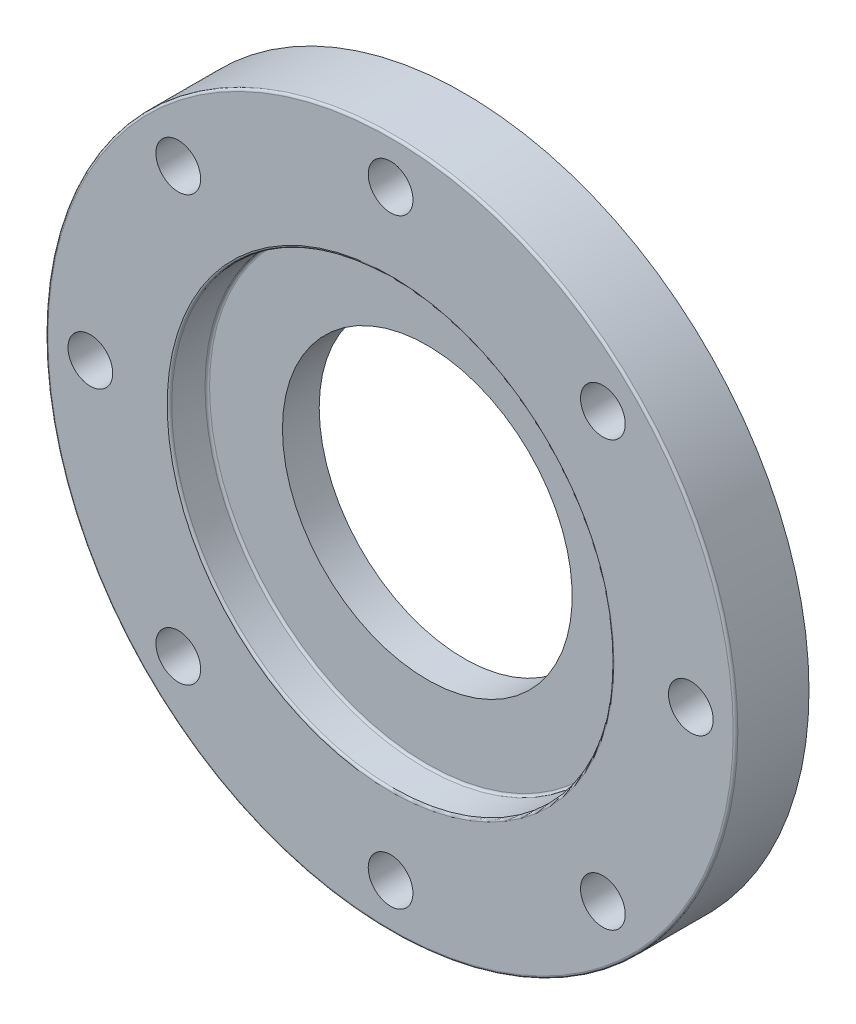
ISO-10303-21;
HEADER;
FILE_DESCRIPTION(('STEP AP214'),'2;1');
FILE_NAME('part.step','',(''),(''),'','','');
FILE_SCHEMA(('AUTOMOTIVE_DESIGN { 1 0 10303 214 1 1 1 1 }'));
ENDSEC;
DATA;
#1=APPLICATION_CONTEXT('core data for automotive mechanical design processes');
#2=APPLICATION_PROTOCOL_DEFINITION('international standard','automotive_design',2000,#1);
#3=PRODUCT_CONTEXT('',#1,'mechanical');
#4=PRODUCT('Part','Part','',(#3));
#5=PRODUCT_RELATED_PRODUCT_CATEGORY('part','',(#4));
#6=PRODUCT_DEFINITION_FORMATION('','',#4);
#7=PRODUCT_DEFINITION_CONTEXT('part definition',#1,'design');
#8=PRODUCT_DEFINITION('design','',#6,#7);
#9=PRODUCT_DEFINITION_SHAPE('','',#8);
#10=(LENGTH_UNIT() NAMED_UNIT(*) SI_UNIT(.MILLI.,.METRE.));
#11=(NAMED_UNIT(*) PLANE_ANGLE_UNIT() SI_UNIT($,.RADIAN.));
#12=(NAMED_UNIT(*) SI_UNIT($,.STERADIAN.) SOLID_ANGLE_UNIT());
#13=UNCERTAINTY_MEASURE_WITH_UNIT(LENGTH_MEASURE(1.E-05),#10,'distance_accuracy_value','');
#14=(GEOMETRIC_REPRESENTATION_CONTEXT(3) GLOBAL_UNCERTAINTY_ASSIGNED_CONTEXT((#13)) GLOBAL_UNIT_ASSIGNED_CONTEXT((#10,
#11,#12)) REPRESENTATION_CONTEXT('',''));
#15=CARTESIAN_POINT('',(0.,0.,0.));
#16=DIRECTION('',(0.,0.,1.));
#17=DIRECTION('',(1.,0.,0.));
#18=AXIS2_PLACEMENT_3D('',#15,#16,#17);
#19=CARTESIAN_POINT('',(0.,0.,36.5125));
#20=DIRECTION('',(0.,0.,-1.));
#21=DIRECTION('',(-1.,0.,0.));
#22=AXIS2_PLACEMENT_3D('',#19,#20,#21);
#23=CYLINDRICAL_SURFACE('',#22,171.45);
#24=CARTESIAN_POINT('',(0.,0.,35.3579545454545));
#25=DIRECTION('',(0.,0.,1.));
#26=DIRECTION('',(1.,0.,0.));
#27=AXIS2_PLACEMENT_3D('',#24,#25,#26);
#28=CIRCLE('',#27,171.45);
#29=CARTESIAN_POINT('',(171.45,0.,35.3579545454545));
#30=VERTEX_POINT('',#29);
#31=EDGE_CURVE('E10',#30,#30,#28,.F.);
#32=ORIENTED_EDGE('',*,*,#31,.T.);
#33=EDGE_LOOP('',(#32));
#34=FACE_BOUND('',#33,.T.);
#35=CARTESIAN_POINT('',(0.,0.,0.));
#36=DIRECTION('',(0.,0.,1.));
#37=DIRECTION('',(1.,0.,0.));
#38=AXIS2_PLACEMENT_3D('',#35,#36,#37);
#39=CIRCLE('',#38,171.45);
#40=CARTESIAN_POINT('',(171.45,0.,0.));
#41=VERTEX_POINT('',#40);
#42=EDGE_CURVE('E70',#41,#41,#39,.T.);
#43=ORIENTED_EDGE('',*,*,#42,.T.);
#44=EDGE_LOOP('',(#43));
#45=FACE_BOUND('',#44,.T.);
#46=ADVANCED_FACE('F38',(#34,#45),#23,.T.);
#47=CARTESIAN_POINT('',(0.,0.,36.5125));
#48=DIRECTION('',(0.,0.,1.));
#49=DIRECTION('',(1.,0.,0.));
#50=AXIS2_PLACEMENT_3D('',#47,#48,#49);
#51=PLANE('',#50);
#52=CARTESIAN_POINT('',(0.,0.,36.5125));
#53=DIRECTION('',(0.,0.,1.));
#54=DIRECTION('',(1.,0.,0.));
#55=AXIS2_PLACEMENT_3D('',#52,#53,#54);
#56=CIRCLE('',#55,111.037468728978);
#57=CARTESIAN_POINT('',(111.037468728978,0.,36.5125));
#58=VERTEX_POINT('',#57);
#59=EDGE_CURVE('E47',#58,#58,#56,.F.);
#60=ORIENTED_EDGE('',*,*,#59,.T.);
#61=EDGE_LOOP('',(#60));
#62=FACE_BOUND('',#61,.T.);
#63=CARTESIAN_POINT('',(0.,0.,36.5125));
#64=DIRECTION('',(0.,0.,1.));
#65=DIRECTION('',(1.,0.,0.));
#66=AXIS2_PLACEMENT_3D('',#63,#64,#65);
#67=CIRCLE('',#66,170.295454545455);
#68=CARTESIAN_POINT('',(170.295454545455,0.,36.5125));
#69=VERTEX_POINT('',#68);
#70=EDGE_CURVE('E52',#69,#69,#67,.T.);
#71=ORIENTED_EDGE('',*,*,#70,.T.);
#72=EDGE_LOOP('',(#71));
#73=FACE_BOUND('',#72,.T.);
#74=CARTESIAN_POINT('',(105.518009422561,105.518009422564,36.5125));
#75=DIRECTION('',(0.,0.,1.));
#76=DIRECTION('',(0.707106781186556,-0.707106781186539,0.));
#77=AXIS2_PLACEMENT_3D('',#74,#75,#76);
#78=CIRCLE('',#77,11.1125);
#79=CARTESIAN_POINT('',(113.375733528497,97.6602853166284,36.5125));
#80=VERTEX_POINT('',#79);
#81=EDGE_CURVE('E131',#80,#80,#78,.T.);
#82=ORIENTED_EDGE('',*,*,#81,.F.);
#83=EDGE_LOOP('',(#82));
#84=FACE_BOUND('',#83,.T.);
#85=CARTESIAN_POINT('',(149.225,1.5630489083666E-12,36.5125));
#86=DIRECTION('',(0.,0.,1.));
#87=DIRECTION('',(0.,-1.,0.));
#88=AXIS2_PLACEMENT_3D('',#85,#86,#87);
#89=CIRCLE('',#88,11.1125);
#90=CARTESIAN_POINT('',(149.225,-11.1124999999984,36.5125));
#91=VERTEX_POINT('',#90);
#92=EDGE_CURVE('E123',#91,#91,#89,.T.);
#93=ORIENTED_EDGE('',*,*,#92,.F.);
#94=EDGE_LOOP('',(#93));
#95=FACE_BOUND('',#94,.T.);
#96=CARTESIAN_POINT('',(105.518009422563,-105.518009422562,36.5125));
#97=DIRECTION('',(0.,0.,1.));
#98=DIRECTION('',(-0.707106781186541,-0.707106781186554,0.));
#99=AXIS2_PLACEMENT_3D('',#96,#97,#98);
#100=CIRCLE('',#99,11.1125);
#101=CARTESIAN_POINT('',(97.660285316628,-113.375733528497,36.5125));
#102=VERTEX_POINT('',#101);
#103=EDGE_CURVE('E115',#102,#102,#100,.T.);
#104=ORIENTED_EDGE('',*,*,#103,.F.);
#105=EDGE_LOOP('',(#104));
#106=FACE_BOUND('',#105,.T.);
#107=CARTESIAN_POINT('',(1.04203260557773E-12,-149.225,36.5125));
#108=DIRECTION('',(0.,0.,1.));
#109=DIRECTION('',(-1.,0.,0.));
#110=AXIS2_PLACEMENT_3D('',#107,#108,#109);
#111=CIRCLE('',#110,11.1125);
#112=CARTESIAN_POINT('',(-11.112499999999,-149.225,36.5125));
#113=VERTEX_POINT('',#112);
#114=EDGE_CURVE('E107',#113,#113,#111,.T.);
#115=ORIENTED_EDGE('',*,*,#114,.F.);
#116=EDGE_LOOP('',(#115));
#117=FACE_BOUND('',#116,.T.);
#118=CARTESIAN_POINT('',(-105.518009422562,-105.518009422563,36.5125));
#119=DIRECTION('',(0.,0.,1.));
#120=DIRECTION('',(-0.707106781186551,0.707106781186544,0.));
#121=AXIS2_PLACEMENT_3D('',#118,#119,#120);
#122=CIRCLE('',#121,11.1125);
#123=CARTESIAN_POINT('',(-113.375733528498,-97.6602853166276,36.5125));
#124=VERTEX_POINT('',#123);
#125=EDGE_CURVE('E99',#124,#124,#122,.T.);
#126=ORIENTED_EDGE('',*,*,#125,.F.);
#127=EDGE_LOOP('',(#126));
#128=FACE_BOUND('',#127,.T.);
#129=CARTESIAN_POINT('',(-149.225,-5.21016302788867E-13,36.5125));
#130=DIRECTION('',(0.,0.,1.));
#131=DIRECTION('',(0.,1.,0.));
#132=AXIS2_PLACEMENT_3D('',#129,#130,#131);
#133=CIRCLE('',#132,11.1125);
#134=CARTESIAN_POINT('',(-149.225,11.1124999999995,36.5125));
#135=VERTEX_POINT('',#134);
#136=EDGE_CURVE('E91',#135,#135,#133,.T.);
#137=ORIENTED_EDGE('',*,*,#136,.F.);
#138=EDGE_LOOP('',(#137));
#139=FACE_BOUND('',#138,.T.);
#140=CARTESIAN_POINT('',(-105.518009422563,105.518009422562,36.5125));
#141=DIRECTION('',(0.,0.,1.));
#142=DIRECTION('',(0.707106781186546,0.707106781186549,0.));
#143=AXIS2_PLACEMENT_3D('',#140,#141,#142);
#144=CIRCLE('',#143,11.1125);
#145=CARTESIAN_POINT('',(-97.6602853166273,113.375733528498,36.5125));
#146=VERTEX_POINT('',#145);
#147=EDGE_CURVE('E83',#146,#146,#144,.T.);
#148=ORIENTED_EDGE('',*,*,#147,.F.);
#149=EDGE_LOOP('',(#148));
#150=FACE_BOUND('',#149,.T.);
#151=CARTESIAN_POINT('',(0.,149.225,36.5125));
#152=DIRECTION('',(0.,0.,1.));
#153=DIRECTION('',(1.,0.,0.));
#154=AXIS2_PLACEMENT_3D('',#151,#152,#153);
#155=CIRCLE('',#154,11.1125);
#156=CARTESIAN_POINT('',(11.1125,149.225,36.5125));
#157=VERTEX_POINT('',#156);
#158=EDGE_CURVE('E75',#157,#157,#155,.T.);
#159=ORIENTED_EDGE('',*,*,#158,.F.);
#160=EDGE_LOOP('',(#159));
#161=FACE_BOUND('',#160,.T.);
#162=ADVANCED_FACE('F160',(#62,#73,#84,#95,#106,#117,#128,#139,#150,#161),#51,.T.);
#163=CARTESIAN_POINT('',(0.,0.,0.));
#164=DIRECTION('',(0.,0.,1.));
#165=DIRECTION('',(1.,0.,0.));
#166=AXIS2_PLACEMENT_3D('',#163,#164,#165);
#167=PLANE('',#166);
#168=CARTESIAN_POINT('',(0.,0.,0.));
#169=DIRECTION('',(0.,0.,-1.));
#170=DIRECTION('',(-1.,0.,0.));
#171=AXIS2_PLACEMENT_3D('',#168,#169,#170);
#172=CIRCLE('',#171,72.);
#173=CARTESIAN_POINT('',(-72.,0.,0.));
#174=VERTEX_POINT('',#173);
#175=EDGE_CURVE('E138',#174,#174,#172,.T.);
#176=ORIENTED_EDGE('',*,*,#175,.F.);
#177=EDGE_LOOP('',(#176));
#178=FACE_BOUND('',#177,.T.);
#179=CARTESIAN_POINT('',(105.518009422561,105.518009422564,0.));
#180=DIRECTION('',(0.,0.,1.));
#181=DIRECTION('',(0.707106781186556,-0.707106781186539,0.));
#182=AXIS2_PLACEMENT_3D('',#179,#180,#181);
#183=CIRCLE('',#182,11.1125);
#184=CARTESIAN_POINT('',(113.375733528497,97.6602853166284,0.));
#185=VERTEX_POINT('',#184);
#186=EDGE_CURVE('E127',#185,#185,#183,.T.);
#187=ORIENTED_EDGE('',*,*,#186,.T.);
#188=EDGE_LOOP('',(#187));
#189=FACE_BOUND('',#188,.T.);
#190=CARTESIAN_POINT('',(149.225,1.5630489083666E-12,0.));
#191=DIRECTION('',(0.,0.,1.));
#192=DIRECTION('',(0.,-1.,0.));
#193=AXIS2_PLACEMENT_3D('',#190,#191,#192);
#194=CIRCLE('',#193,11.1125);
#195=CARTESIAN_POINT('',(149.225,-11.1124999999984,0.));
#196=VERTEX_POINT('',#195);
#197=EDGE_CURVE('E119',#196,#196,#194,.T.);
#198=ORIENTED_EDGE('',*,*,#197,.T.);
#199=EDGE_LOOP('',(#198));
#200=FACE_BOUND('',#199,.T.);
#201=CARTESIAN_POINT('',(105.518009422563,-105.518009422562,0.));
#202=DIRECTION('',(0.,0.,1.));
#203=DIRECTION('',(-0.707106781186541,-0.707106781186554,0.));
#204=AXIS2_PLACEMENT_3D('',#201,#202,#203);
#205=CIRCLE('',#204,11.1125);
#206=CARTESIAN_POINT('',(97.660285316628,-113.375733528497,0.));
#207=VERTEX_POINT('',#206);
#208=EDGE_CURVE('E111',#207,#207,#205,.T.);
#209=ORIENTED_EDGE('',*,*,#208,.T.);
#210=EDGE_LOOP('',(#209));
#211=FACE_BOUND('',#210,.T.);
#212=CARTESIAN_POINT('',(1.04203260557773E-12,-149.225,0.));
#213=DIRECTION('',(0.,0.,1.));
#214=DIRECTION('',(-1.,0.,0.));
#215=AXIS2_PLACEMENT_3D('',#212,#213,#214);
#216=CIRCLE('',#215,11.1125);
#217=CARTESIAN_POINT('',(-11.112499999999,-149.225,0.));
#218=VERTEX_POINT('',#217);
#219=EDGE_CURVE('E103',#218,#218,#216,.T.);
#220=ORIENTED_EDGE('',*,*,#219,.T.);
#221=EDGE_LOOP('',(#220));
#222=FACE_BOUND('',#221,.T.);
#223=CARTESIAN_POINT('',(-105.518009422562,-105.518009422563,0.));
#224=DIRECTION('',(0.,0.,1.));
#225=DIRECTION('',(-0.707106781186551,0.707106781186544,0.));
#226=AXIS2_PLACEMENT_3D('',#223,#224,#225);
#227=CIRCLE('',#226,11.1125);
#228=CARTESIAN_POINT('',(-113.375733528498,-97.6602853166276,0.));
#229=VERTEX_POINT('',#228);
#230=EDGE_CURVE('E95',#229,#229,#227,.T.);
#231=ORIENTED_EDGE('',*,*,#230,.T.);
#232=EDGE_LOOP('',(#231));
#233=FACE_BOUND('',#232,.T.);
#234=CARTESIAN_POINT('',(-149.225,-5.21016302788867E-13,0.));
#235=DIRECTION('',(0.,0.,1.));
#236=DIRECTION('',(0.,1.,0.));
#237=AXIS2_PLACEMENT_3D('',#234,#235,#236);
#238=CIRCLE('',#237,11.1125);
#239=CARTESIAN_POINT('',(-149.225,11.1124999999995,0.));
#240=VERTEX_POINT('',#239);
#241=EDGE_CURVE('E87',#240,#240,#238,.T.);
#242=ORIENTED_EDGE('',*,*,#241,.T.);
#243=EDGE_LOOP('',(#242));
#244=FACE_BOUND('',#243,.T.);
#245=CARTESIAN_POINT('',(-105.518009422563,105.518009422562,0.));
#246=DIRECTION('',(0.,0.,1.));
#247=DIRECTION('',(0.707106781186546,0.707106781186549,0.));
#248=AXIS2_PLACEMENT_3D('',#245,#246,#247);
#249=CIRCLE('',#248,11.1125);
#250=CARTESIAN_POINT('',(-97.6602853166273,113.375733528498,0.));
#251=VERTEX_POINT('',#250);
#252=EDGE_CURVE('E79',#251,#251,#249,.T.);
#253=ORIENTED_EDGE('',*,*,#252,.T.);
#254=EDGE_LOOP('',(#253));
#255=FACE_BOUND('',#254,.T.);
#256=CARTESIAN_POINT('',(0.,149.225,0.));
#257=DIRECTION('',(0.,0.,1.));
#258=DIRECTION('',(1.,0.,0.));
#259=AXIS2_PLACEMENT_3D('',#256,#257,#258);
#260=CIRCLE('',#259,11.1125);
#261=CARTESIAN_POINT('',(11.1125,149.225,0.));
#262=VERTEX_POINT('',#261);
#263=EDGE_CURVE('E74',#262,#262,#260,.T.);
#264=ORIENTED_EDGE('',*,*,#263,.T.);
#265=EDGE_LOOP('',(#264));
#266=FACE_BOUND('',#265,.T.);
#267=ORIENTED_EDGE('',*,*,#42,.F.);
#268=EDGE_LOOP('',(#267));
#269=FACE_BOUND('',#268,.T.);
#270=ADVANCED_FACE('F165',(#178,#189,#200,#211,#222,#233,#244,#255,#266,#269),#167,.F.);
#271=CARTESIAN_POINT('',(0.,149.225,0.));
#272=DIRECTION('',(0.,0.,1.));
#273=DIRECTION('',(1.,0.,0.));
#274=AXIS2_PLACEMENT_3D('',#271,#272,#273);
#275=CYLINDRICAL_SURFACE('',#274,11.1125);
#276=ORIENTED_EDGE('',*,*,#263,.F.);
#277=EDGE_LOOP('',(#276));
#278=FACE_BOUND('',#277,.T.);
#279=ORIENTED_EDGE('',*,*,#158,.T.);
#280=EDGE_LOOP('',(#279));
#281=FACE_BOUND('',#280,.T.);
#282=ADVANCED_FACE('F201',(#278,#281),#275,.F.);
#283=CARTESIAN_POINT('',(-105.518009422563,105.518009422562,0.));
#284=DIRECTION('',(0.,0.,1.));
#285=DIRECTION('',(1.,0.,0.));
#286=AXIS2_PLACEMENT_3D('',#283,#284,#285);
#287=CYLINDRICAL_SURFACE('',#286,11.1125);
#288=ORIENTED_EDGE('',*,*,#252,.F.);
#289=EDGE_LOOP('',(#288));
#290=FACE_BOUND('',#289,.T.);
#291=ORIENTED_EDGE('',*,*,#147,.T.);
#292=EDGE_LOOP('',(#291));
#293=FACE_BOUND('',#292,.T.);
#294=ADVANCED_FACE('F203',(#290,#293),#287,.F.);
#295=CARTESIAN_POINT('',(-149.225,-5.21016302788867E-13,0.));
#296=DIRECTION('',(0.,0.,1.));
#297=DIRECTION('',(1.,0.,0.));
#298=AXIS2_PLACEMENT_3D('',#295,#296,#297);
#299=CYLINDRICAL_SURFACE('',#298,11.1125);
#300=ORIENTED_EDGE('',*,*,#241,.F.);
#301=EDGE_LOOP('',(#300));
#302=FACE_BOUND('',#301,.T.);
#303=ORIENTED_EDGE('',*,*,#136,.T.);
#304=EDGE_LOOP('',(#303));
#305=FACE_BOUND('',#304,.T.);
#306=ADVANCED_FACE('F210',(#302,#305),#299,.F.);
#307=CARTESIAN_POINT('',(-105.518009422562,-105.518009422563,0.));
#308=DIRECTION('',(0.,0.,1.));
#309=DIRECTION('',(1.,0.,0.));
#310=AXIS2_PLACEMENT_3D('',#307,#308,#309);
#311=CYLINDRICAL_SURFACE('',#310,11.1125);
#312=ORIENTED_EDGE('',*,*,#230,.F.);
#313=EDGE_LOOP('',(#312));
#314=FACE_BOUND('',#313,.T.);
#315=ORIENTED_EDGE('',*,*,#125,.T.);
#316=EDGE_LOOP('',(#315));
#317=FACE_BOUND('',#316,.T.);
#318=ADVANCED_FACE('F219',(#314,#317),#311,.F.);
#319=CARTESIAN_POINT('',(1.04203260557773E-12,-149.225,0.));
#320=DIRECTION('',(0.,0.,1.));
#321=DIRECTION('',(1.,0.,0.));
#322=AXIS2_PLACEMENT_3D('',#319,#320,#321);
#323=CYLINDRICAL_SURFACE('',#322,11.1125);
#324=ORIENTED_EDGE('',*,*,#219,.F.);
#325=EDGE_LOOP('',(#324));
#326=FACE_BOUND('',#325,.T.);
#327=ORIENTED_EDGE('',*,*,#114,.T.);
#328=EDGE_LOOP('',(#327));
#329=FACE_BOUND('',#328,.T.);
#330=ADVANCED_FACE('F223',(#326,#329),#323,.F.);
#331=CARTESIAN_POINT('',(105.518009422563,-105.518009422562,0.));
#332=DIRECTION('',(0.,0.,1.));
#333=DIRECTION('',(1.,0.,0.));
#334=AXIS2_PLACEMENT_3D('',#331,#332,#333);
#335=CYLINDRICAL_SURFACE('',#334,11.1125);
#336=ORIENTED_EDGE('',*,*,#208,.F.);
#337=EDGE_LOOP('',(#336));
#338=FACE_BOUND('',#337,.T.);
#339=ORIENTED_EDGE('',*,*,#103,.T.);
#340=EDGE_LOOP('',(#339));
#341=FACE_BOUND('',#340,.T.);
#342=ADVANCED_FACE('F227',(#338,#341),#335,.F.);
#343=CARTESIAN_POINT('',(149.225,1.5630489083666E-12,0.));
#344=DIRECTION('',(0.,0.,1.));
#345=DIRECTION('',(1.,0.,0.));
#346=AXIS2_PLACEMENT_3D('',#343,#344,#345);
#347=CYLINDRICAL_SURFACE('',#346,11.1125);
#348=ORIENTED_EDGE('',*,*,#197,.F.);
#349=EDGE_LOOP('',(#348));
#350=FACE_BOUND('',#349,.T.);
#351=ORIENTED_EDGE('',*,*,#92,.T.);
#352=EDGE_LOOP('',(#351));
#353=FACE_BOUND('',#352,.T.);
#354=ADVANCED_FACE('F231',(#350,#353),#347,.F.);
#355=CARTESIAN_POINT('',(105.518009422561,105.518009422564,0.));
#356=DIRECTION('',(0.,0.,1.));
#357=DIRECTION('',(1.,0.,0.));
#358=AXIS2_PLACEMENT_3D('',#355,#356,#357);
#359=CYLINDRICAL_SURFACE('',#358,11.1125);
#360=ORIENTED_EDGE('',*,*,#186,.F.);
#361=EDGE_LOOP('',(#360));
#362=FACE_BOUND('',#361,.T.);
#363=ORIENTED_EDGE('',*,*,#81,.T.);
#364=EDGE_LOOP('',(#363));
#365=FACE_BOUND('',#364,.T.);
#366=ADVANCED_FACE('F235',(#362,#365),#359,.F.);
#367=CARTESIAN_POINT('',(0.,109.347,18.25625));
#368=DIRECTION('',(0.,0.,-1.));
#369=DIRECTION('',(0.,1.,0.));
#370=AXIS2_PLACEMENT_3D('',#367,#368,#369);
#371=PLANE('',#370);
#372=CARTESIAN_POINT('',(0.,0.,18.25625));
#373=DIRECTION('',(0.,0.,-1.));
#374=DIRECTION('',(0.,1.,0.));
#375=AXIS2_PLACEMENT_3D('',#372,#373,#374);
#376=CIRCLE('',#375,72.);
#377=CARTESIAN_POINT('',(-72.,0.,18.25625));
#378=VERTEX_POINT('',#377);
#379=EDGE_CURVE('E42',#378,#378,#376,.T.);
#380=ORIENTED_EDGE('',*,*,#379,.T.);
#381=EDGE_LOOP('',(#380));
#382=FACE_BOUND('',#381,.T.);
#383=CARTESIAN_POINT('',(0.,0.,18.25625));
#384=DIRECTION('',(0.,0.,-1.));
#385=DIRECTION('',(0.,1.,0.));
#386=AXIS2_PLACEMENT_3D('',#383,#384,#385);
#387=CIRCLE('',#386,108.228031271022);
#388=CARTESIAN_POINT('',(0.,108.228031271022,18.25625));
#389=VERTEX_POINT('',#388);
#390=EDGE_CURVE('E58',#389,#389,#387,.F.);
#391=ORIENTED_EDGE('',*,*,#390,.T.);
#392=EDGE_LOOP('',(#391));
#393=FACE_BOUND('',#392,.T.);
#394=ADVANCED_FACE('F147',(#382,#393),#371,.F.);
#395=CARTESIAN_POINT('',(0.,0.,18.25625));
#396=DIRECTION('',(0.,0.,1.));
#397=DIRECTION('',(0.,-1.,0.));
#398=AXIS2_PLACEMENT_3D('',#395,#396,#397);
#399=CONICAL_SURFACE('',#398,109.347,0.0312941281419109);
#400=CARTESIAN_POINT('',(0.,0.,19.3746708580904));
#401=DIRECTION('',(0.,0.,1.));
#402=DIRECTION('',(0.,-1.,0.));
#403=AXIS2_PLACEMENT_3D('',#400,#401,#402);
#404=CIRCLE('',#403,109.382011435558);
#405=CARTESIAN_POINT('',(0.,-109.382011435558,19.3746708580904));
#406=VERTEX_POINT('',#405);
#407=EDGE_CURVE('E62',#406,#406,#404,.F.);
#408=ORIENTED_EDGE('',*,*,#407,.T.);
#409=EDGE_LOOP('',(#408));
#410=FACE_BOUND('',#409,.T.);
#411=CARTESIAN_POINT('',(0.,0.,35.3940791419096));
#412=DIRECTION('',(0.,0.,1.));
#413=DIRECTION('',(0.,-1.,0.));
#414=AXIS2_PLACEMENT_3D('',#411,#412,#413);
#415=CIRCLE('',#414,109.883488564442);
#416=CARTESIAN_POINT('',(0.,-109.883488564442,35.3940791419096));
#417=VERTEX_POINT('',#416);
#418=EDGE_CURVE('E66',#417,#417,#415,.T.);
#419=ORIENTED_EDGE('',*,*,#418,.T.);
#420=EDGE_LOOP('',(#419));
#421=FACE_BOUND('',#420,.T.);
#422=ADVANCED_FACE('F173',(#410,#421),#399,.F.);
#423=CARTESIAN_POINT('',(0.,0.,19.4107954545455));
#424=DIRECTION('',(0.,0.,-1.));
#425=DIRECTION('',(0.,1.,0.));
#426=AXIS2_PLACEMENT_3D('',#423,#424,#425);
#427=TOROIDAL_SURFACE('',#426,108.228031271022,1.15454545454545);
#428=ORIENTED_EDGE('',*,*,#390,.F.);
#429=EDGE_LOOP('',(#428));
#430=FACE_BOUND('',#429,.T.);
#431=ORIENTED_EDGE('',*,*,#407,.F.);
#432=EDGE_LOOP('',(#431));
#433=FACE_BOUND('',#432,.T.);
#434=ADVANCED_FACE('F171',(#430,#433),#427,.F.);
#435=CARTESIAN_POINT('',(0.,0.,35.3579545454545));
#436=DIRECTION('',(0.,0.,1.));
#437=DIRECTION('',(1.,0.,0.));
#438=AXIS2_PLACEMENT_3D('',#435,#436,#437);
#439=TOROIDAL_SURFACE('',#438,111.037468728978,1.15454545454545);
#440=ORIENTED_EDGE('',*,*,#418,.F.);
#441=EDGE_LOOP('',(#440));
#442=FACE_BOUND('',#441,.T.);
#443=ORIENTED_EDGE('',*,*,#59,.F.);
#444=EDGE_LOOP('',(#443));
#445=FACE_BOUND('',#444,.T.);
#446=ADVANCED_FACE('F156',(#442,#445),#439,.T.);
#447=CARTESIAN_POINT('',(0.,0.,35.3579545454545));
#448=DIRECTION('',(0.,0.,1.));
#449=DIRECTION('',(1.,0.,0.));
#450=AXIS2_PLACEMENT_3D('',#447,#448,#449);
#451=TOROIDAL_SURFACE('',#450,170.295454545455,1.15454545454545);
#452=ORIENTED_EDGE('',*,*,#31,.F.);
#453=EDGE_LOOP('',(#452));
#454=FACE_BOUND('',#453,.T.);
#455=ORIENTED_EDGE('',*,*,#70,.F.);
#456=EDGE_LOOP('',(#455));
#457=FACE_BOUND('',#456,.T.);
#458=ADVANCED_FACE('F40',(#454,#457),#451,.T.);
#459=CARTESIAN_POINT('',(0.,0.,237.236));
#460=DIRECTION('',(0.,0.,-1.));
#461=DIRECTION('',(-1.,0.,0.));
#462=AXIS2_PLACEMENT_3D('',#459,#460,#461);
#463=CYLINDRICAL_SURFACE('',#462,72.);
#464=CARTESIAN_POINT('',(-72.,0.,0.));
#465=CARTESIAN_POINT('',(-72.,0.,0.190169270833337));
#466=CARTESIAN_POINT('',(-72.,0.,0.380338541666673));
#467=CARTESIAN_POINT('',(-72.,0.,0.760677083333337));
#468=CARTESIAN_POINT('',(-72.,0.,0.950846354166664));
#469=CARTESIAN_POINT('',(-72.,0.,1.33118489583333));
#470=CARTESIAN_POINT('',(-72.,0.,1.52135416666666));
#471=CARTESIAN_POINT('',(-72.,0.,1.90169270833334));
#472=CARTESIAN_POINT('',(-72.,0.,2.09186197916667));
#473=CARTESIAN_POINT('',(-72.,0.,2.47220052083334));
#474=CARTESIAN_POINT('',(-72.,0.,2.66236979166667));
#475=CARTESIAN_POINT('',(-72.,0.,3.04270833333333));
#476=CARTESIAN_POINT('',(-72.,0.,3.23287760416667));
#477=CARTESIAN_POINT('',(-72.,0.,3.61321614583334));
#478=CARTESIAN_POINT('',(-72.,0.,3.80338541666667));
#479=CARTESIAN_POINT('',(-72.,0.,4.18372395833335));
#480=CARTESIAN_POINT('',(-72.,0.,4.37389322916668));
#481=CARTESIAN_POINT('',(-72.,0.,4.75423177083335));
#482=CARTESIAN_POINT('',(-72.,0.,4.94440104166668));
#483=CARTESIAN_POINT('',(-72.,0.,5.32473958333334));
#484=CARTESIAN_POINT('',(-72.,0.,5.51490885416668));
#485=CARTESIAN_POINT('',(-72.,0.,5.89524739583335));
#486=CARTESIAN_POINT('',(-72.,0.,6.08541666666669));
#487=CARTESIAN_POINT('',(-72.,0.,6.46575520833335));
#488=CARTESIAN_POINT('',(-72.,0.,6.65592447916668));
#489=CARTESIAN_POINT('',(-72.,0.,7.03626302083334));
#490=CARTESIAN_POINT('',(-72.,0.,7.22643229166668));
#491=CARTESIAN_POINT('',(-72.,0.,7.60677083333335));
#492=CARTESIAN_POINT('',(-72.,0.,7.79694010416669));
#493=CARTESIAN_POINT('',(-72.,0.,8.17727864583335));
#494=CARTESIAN_POINT('',(-72.,0.,8.36744791666668));
#495=CARTESIAN_POINT('',(-72.,0.,8.74778645833334));
#496=CARTESIAN_POINT('',(-72.,0.,8.93795572916668));
#497=CARTESIAN_POINT('',(-72.,0.,9.31829427083335));
#498=CARTESIAN_POINT('',(-72.,0.,9.50846354166669));
#499=CARTESIAN_POINT('',(-72.,0.,9.88880208333335));
#500=CARTESIAN_POINT('',(-72.,0.,10.0789713541667));
#501=CARTESIAN_POINT('',(-72.,0.,10.4593098958333));
#502=CARTESIAN_POINT('',(-72.,0.,10.6494791666667));
#503=CARTESIAN_POINT('',(-72.,0.,11.0298177083334));
#504=CARTESIAN_POINT('',(-72.,0.,11.2199869791667));
#505=CARTESIAN_POINT('',(-72.,0.,11.6003255208334));
#506=CARTESIAN_POINT('',(-72.,0.,11.7904947916667));
#507=CARTESIAN_POINT('',(-72.,0.,12.1708333333333));
#508=CARTESIAN_POINT('',(-72.,0.,12.3610026041667));
#509=CARTESIAN_POINT('',(-72.,0.,12.7413411458334));
#510=CARTESIAN_POINT('',(-72.,0.,12.9315104166667));
#511=CARTESIAN_POINT('',(-72.,0.,13.3118489583334));
#512=CARTESIAN_POINT('',(-72.,0.,13.5020182291667));
#513=CARTESIAN_POINT('',(-72.,0.,13.8823567708333));
#514=CARTESIAN_POINT('',(-72.,0.,14.0725260416667));
#515=CARTESIAN_POINT('',(-72.,0.,14.4528645833334));
#516=CARTESIAN_POINT('',(-72.,0.,14.6430338541667));
#517=CARTESIAN_POINT('',(-72.,0.,15.0233723958334));
#518=CARTESIAN_POINT('',(-72.,0.,15.2135416666667));
#519=CARTESIAN_POINT('',(-72.,0.,15.5938802083334));
#520=CARTESIAN_POINT('',(-72.,0.,15.7840494791667));
#521=CARTESIAN_POINT('',(-72.,0.,16.1643880208334));
#522=CARTESIAN_POINT('',(-72.,0.,16.3545572916667));
#523=CARTESIAN_POINT('',(-72.,0.,16.7348958333334));
#524=CARTESIAN_POINT('',(-72.,0.,16.9250651041667));
#525=CARTESIAN_POINT('',(-72.,0.,17.3054036458334));
#526=CARTESIAN_POINT('',(-72.,0.,17.4955729166667));
#527=CARTESIAN_POINT('',(-72.,0.,17.8759114583334));
#528=CARTESIAN_POINT('',(-72.,0.,18.0660807291667));
#529=CARTESIAN_POINT('',(-72.,0.,18.25625));
#530=B_SPLINE_CURVE_WITH_KNOTS('',3,(#464,#465,#466,#467,#468,#469,#470,#471,#472,#473,#474,
#475,#476,#477,#478,#479,#480,#481,#482,#483,#484,#485,#486,#487,#488,#489,#490,#491,#492,#493,
#494,#495,#496,#497,#498,#499,#500,#501,#502,#503,#504,#505,#506,#507,#508,#509,#510,#511,#512,
#513,#514,#515,#516,#517,#518,#519,#520,#521,#522,#523,#524,#525,#526,#527,#528,#529),
.UNSPECIFIED.,.F.,.F.,(4,2,2,2,2,2,2,2,2,2,2,2,2,2,2,2,2,2,2,2,2,2,2,2,2,2,2,2,2,2,2,2,4),(0.,
0.57050781250001,1.14101562499999,1.7115234375,2.28203125000001,2.85253906249999,3.423046875,
3.99355468750001,4.56406250000002,5.1345703125,5.70507812500001,6.27558593750002,6.84609375,
7.41660156250001,7.98710937500002,8.55761718750001,9.12812500000001,9.69863281250002,
10.269140625,10.8396484375,11.41015625,11.9806640625,12.551171875,13.1216796875,13.6921875,
14.2626953125,14.833203125,15.4037109375,15.97421875,16.5447265625,17.115234375,17.6857421875,
18.25625),.UNSPECIFIED.);
#531=EDGE_CURVE('BSEAM150',#174,#378,#530,.T.);
#532=ORIENTED_EDGE('',*,*,#175,.T.);
#533=ORIENTED_EDGE('',*,*,#379,.F.);
#534=ORIENTED_EDGE('',*,*,#531,.T.);
#535=ORIENTED_EDGE('',*,*,#531,.F.);
#536=EDGE_LOOP('',(#532,#534,#533,#535));
#537=FACE_BOUND('',#536,.T.);
#538=ADVANCED_FACE('F150',(#537),#463,.F.);
#539=CLOSED_SHELL('',(#46,#162,#270,#282,#294,#306,#318,#330,#342,#354,#366,#394,#422,#434,#446,
#458,#538));
#540=MANIFOLD_SOLID_BREP('B2',#539);
#541=ADVANCED_BREP_SHAPE_REPRESENTATION('',(#18,#540),#14);
#542=SHAPE_DEFINITION_REPRESENTATION(#9,#541);
ENDSEC;
END-ISO-10303-21;
